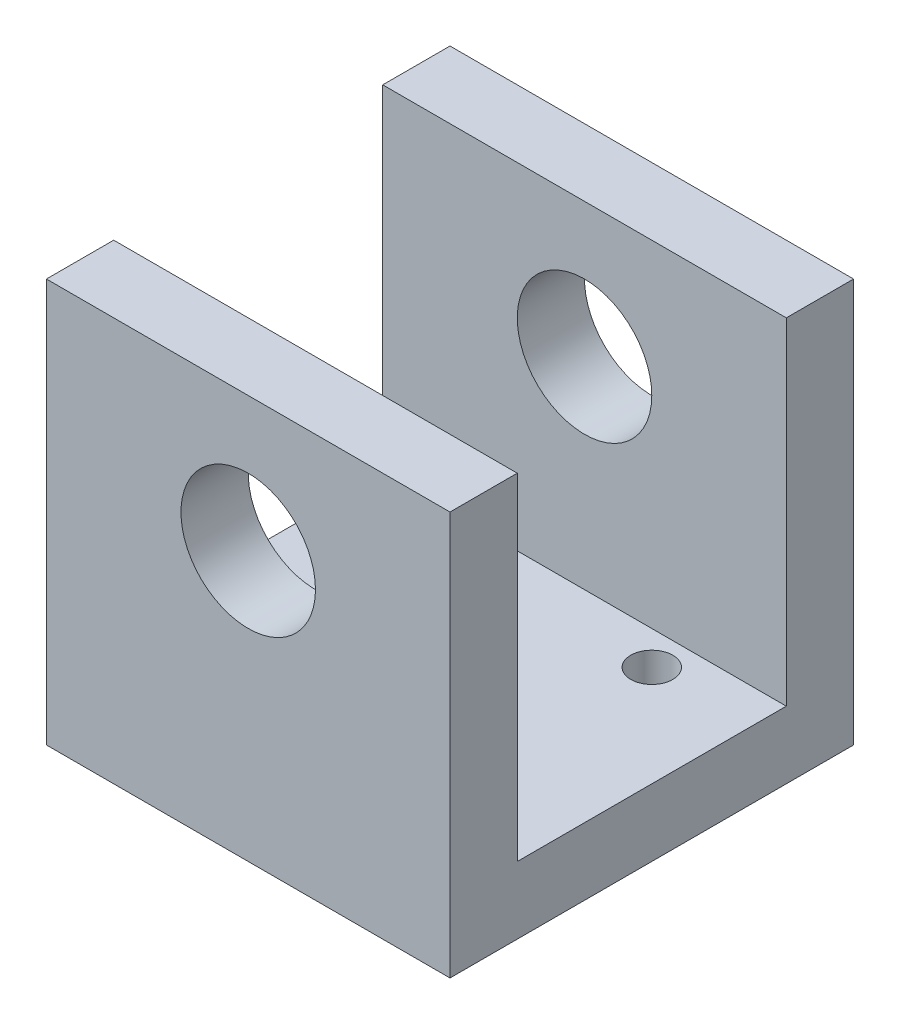
ISO-10303-21;
HEADER;
FILE_DESCRIPTION(('STEP AP214'),'2;1');
FILE_NAME('part.step','',(''),(''),'','','');
FILE_SCHEMA(('AUTOMOTIVE_DESIGN { 1 0 10303 214 1 1 1 1 }'));
ENDSEC;
DATA;
#1=APPLICATION_CONTEXT('core data for automotive mechanical design processes');
#2=APPLICATION_PROTOCOL_DEFINITION('international standard','automotive_design',2000,#1);
#3=PRODUCT_CONTEXT('',#1,'mechanical');
#4=PRODUCT('Part','Part','',(#3));
#5=PRODUCT_RELATED_PRODUCT_CATEGORY('part','',(#4));
#6=PRODUCT_DEFINITION_FORMATION('','',#4);
#7=PRODUCT_DEFINITION_CONTEXT('part definition',#1,'design');
#8=PRODUCT_DEFINITION('design','',#6,#7);
#9=PRODUCT_DEFINITION_SHAPE('','',#8);
#10=(LENGTH_UNIT() NAMED_UNIT(*) SI_UNIT(.MILLI.,.METRE.));
#11=(NAMED_UNIT(*) PLANE_ANGLE_UNIT() SI_UNIT($,.RADIAN.));
#12=(NAMED_UNIT(*) SI_UNIT($,.STERADIAN.) SOLID_ANGLE_UNIT());
#13=UNCERTAINTY_MEASURE_WITH_UNIT(LENGTH_MEASURE(1.E-05),#10,'distance_accuracy_value','');
#14=(GEOMETRIC_REPRESENTATION_CONTEXT(3) GLOBAL_UNCERTAINTY_ASSIGNED_CONTEXT((#13)) GLOBAL_UNIT_ASSIGNED_CONTEXT((#10,
#11,#12)) REPRESENTATION_CONTEXT('',''));
#15=CARTESIAN_POINT('',(0.,0.,0.));
#16=DIRECTION('',(0.,0.,1.));
#17=DIRECTION('',(1.,0.,0.));
#18=AXIS2_PLACEMENT_3D('',#15,#16,#17);
#19=CARTESIAN_POINT('',(57.15,12.7,-57.15));
#20=DIRECTION('',(0.,1.,0.));
#21=DIRECTION('',(0.,0.,1.));
#22=AXIS2_PLACEMENT_3D('',#19,#20,#21);
#23=CYLINDRICAL_SURFACE('',#22,3.96875);
#24=CARTESIAN_POINT('',(57.15,0.,-57.15));
#25=DIRECTION('',(0.,1.,0.));
#26=DIRECTION('',(0.,0.,1.));
#27=AXIS2_PLACEMENT_3D('',#24,#25,#26);
#28=CIRCLE('',#27,3.96875);
#29=CARTESIAN_POINT('',(57.15,0.,-53.18125));
#30=VERTEX_POINT('',#29);
#31=EDGE_CURVE('E47',#30,#30,#28,.T.);
#32=ORIENTED_EDGE('',*,*,#31,.F.);
#33=EDGE_LOOP('',(#32));
#34=FACE_BOUND('',#33,.T.);
#35=CARTESIAN_POINT('',(57.15,12.7,-57.15));
#36=DIRECTION('',(0.,1.,0.));
#37=DIRECTION('',(0.,0.,1.));
#38=AXIS2_PLACEMENT_3D('',#35,#36,#37);
#39=CIRCLE('',#38,3.96875);
#40=CARTESIAN_POINT('',(57.15,12.7,-53.18125));
#41=VERTEX_POINT('',#40);
#42=EDGE_CURVE('E11',#41,#41,#39,.T.);
#43=ORIENTED_EDGE('',*,*,#42,.T.);
#44=EDGE_LOOP('',(#43));
#45=FACE_BOUND('',#44,.T.);
#46=ADVANCED_FACE('F39',(#34,#45),#23,.F.);
#47=CARTESIAN_POINT('',(19.05,12.7,-57.15));
#48=DIRECTION('',(0.,1.,0.));
#49=DIRECTION('',(0.,0.,1.));
#50=AXIS2_PLACEMENT_3D('',#47,#48,#49);
#51=CYLINDRICAL_SURFACE('',#50,3.96875);
#52=CARTESIAN_POINT('',(19.05,0.,-57.15));
#53=DIRECTION('',(0.,1.,0.));
#54=DIRECTION('',(0.,0.,1.));
#55=AXIS2_PLACEMENT_3D('',#52,#53,#54);
#56=CIRCLE('',#55,3.96875);
#57=CARTESIAN_POINT('',(19.05,0.,-53.18125));
#58=VERTEX_POINT('',#57);
#59=EDGE_CURVE('E167',#58,#58,#56,.T.);
#60=ORIENTED_EDGE('',*,*,#59,.F.);
#61=EDGE_LOOP('',(#60));
#62=FACE_BOUND('',#61,.T.);
#63=CARTESIAN_POINT('',(19.05,12.7,-57.15));
#64=DIRECTION('',(0.,1.,0.));
#65=DIRECTION('',(0.,0.,1.));
#66=AXIS2_PLACEMENT_3D('',#63,#64,#65);
#67=CIRCLE('',#66,3.96875);
#68=CARTESIAN_POINT('',(19.05,12.7,-53.18125));
#69=VERTEX_POINT('',#68);
#70=EDGE_CURVE('E174',#69,#69,#67,.T.);
#71=ORIENTED_EDGE('',*,*,#70,.T.);
#72=EDGE_LOOP('',(#71));
#73=FACE_BOUND('',#72,.T.);
#74=ADVANCED_FACE('F183',(#62,#73),#51,.F.);
#75=CARTESIAN_POINT('',(76.2,76.2,0.));
#76=DIRECTION('',(0.,0.,-1.));
#77=DIRECTION('',(0.,1.,0.));
#78=AXIS2_PLACEMENT_3D('',#75,#76,#77);
#79=PLANE('',#78);
#80=CARTESIAN_POINT('',(38.1,50.8,0.));
#81=DIRECTION('',(0.,0.,1.));
#82=DIRECTION('',(1.,0.,0.));
#83=AXIS2_PLACEMENT_3D('',#80,#81,#82);
#84=CIRCLE('',#83,12.7);
#85=CARTESIAN_POINT('',(50.8,50.8,0.));
#86=VERTEX_POINT('',#85);
#87=EDGE_CURVE('E312',#86,#86,#84,.T.);
#88=ORIENTED_EDGE('',*,*,#87,.F.);
#89=EDGE_LOOP('',(#88));
#90=FACE_BOUND('',#89,.T.);
#91=DIRECTION('',(0.,-1.,0.));
#92=VECTOR('',#91,1.);
#93=CARTESIAN_POINT('',(0.,76.2,0.));
#94=LINE('',#93,#92);
#95=CARTESIAN_POINT('',(0.,76.2,0.));
#96=VERTEX_POINT('',#95);
#97=CARTESIAN_POINT('',(0.,0.,0.));
#98=VERTEX_POINT('',#97);
#99=EDGE_CURVE('E137',#96,#98,#94,.T.);
#100=ORIENTED_EDGE('',*,*,#99,.T.);
#101=DIRECTION('',(-1.,0.,0.));
#102=VECTOR('',#101,1.);
#103=CARTESIAN_POINT('',(76.2,0.,0.));
#104=LINE('',#103,#102);
#105=CARTESIAN_POINT('',(76.2,0.,0.));
#106=VERTEX_POINT('',#105);
#107=EDGE_CURVE('E165',#106,#98,#104,.T.);
#108=ORIENTED_EDGE('',*,*,#107,.F.);
#109=DIRECTION('',(0.,-1.,0.));
#110=VECTOR('',#109,1.);
#111=CARTESIAN_POINT('',(76.2,76.2,0.));
#112=LINE('',#111,#110);
#113=CARTESIAN_POINT('',(76.2,76.2,0.));
#114=VERTEX_POINT('',#113);
#115=EDGE_CURVE('E152',#114,#106,#112,.T.);
#116=ORIENTED_EDGE('',*,*,#115,.F.);
#117=DIRECTION('',(-1.,0.,0.));
#118=VECTOR('',#117,1.);
#119=CARTESIAN_POINT('',(76.2,76.2,0.));
#120=LINE('',#119,#118);
#121=EDGE_CURVE('E133',#114,#96,#120,.T.);
#122=ORIENTED_EDGE('',*,*,#121,.T.);
#123=EDGE_LOOP('',(#100,#108,#116,#122));
#124=FACE_BOUND('',#123,.T.);
#125=ADVANCED_FACE('F214',(#90,#124),#79,.F.);
#126=CARTESIAN_POINT('',(76.2,0.,0.));
#127=DIRECTION('',(0.,1.,0.));
#128=DIRECTION('',(0.,0.,1.));
#129=AXIS2_PLACEMENT_3D('',#126,#127,#128);
#130=PLANE('',#129);
#131=CARTESIAN_POINT('',(57.15,0.,-19.05));
#132=DIRECTION('',(0.,1.,0.));
#133=DIRECTION('',(0.,0.,1.));
#134=AXIS2_PLACEMENT_3D('',#131,#132,#133);
#135=CIRCLE('',#134,3.96875);
#136=CARTESIAN_POINT('',(57.15,0.,-15.08125));
#137=VERTEX_POINT('',#136);
#138=EDGE_CURVE('E315',#137,#137,#135,.T.);
#139=ORIENTED_EDGE('',*,*,#138,.T.);
#140=EDGE_LOOP('',(#139));
#141=FACE_BOUND('',#140,.T.);
#142=CARTESIAN_POINT('',(19.05,0.,-19.05));
#143=DIRECTION('',(0.,1.,0.));
#144=DIRECTION('',(0.,0.,1.));
#145=AXIS2_PLACEMENT_3D('',#142,#143,#144);
#146=CIRCLE('',#145,3.96875);
#147=CARTESIAN_POINT('',(19.05,0.,-15.08125));
#148=VERTEX_POINT('',#147);
#149=EDGE_CURVE('E306',#148,#148,#146,.T.);
#150=ORIENTED_EDGE('',*,*,#149,.T.);
#151=EDGE_LOOP('',(#150));
#152=FACE_BOUND('',#151,.T.);
#153=DIRECTION('',(0.,0.,-1.));
#154=VECTOR('',#153,1.);
#155=CARTESIAN_POINT('',(0.,0.,0.));
#156=LINE('',#155,#154);
#157=CARTESIAN_POINT('',(0.,0.,-76.2));
#158=VERTEX_POINT('',#157);
#159=EDGE_CURVE('E140',#98,#158,#156,.T.);
#160=ORIENTED_EDGE('',*,*,#159,.T.);
#161=DIRECTION('',(-1.,0.,0.));
#162=VECTOR('',#161,1.);
#163=CARTESIAN_POINT('',(76.2,0.,-76.2));
#164=LINE('',#163,#162);
#165=CARTESIAN_POINT('',(76.2,0.,-76.2));
#166=VERTEX_POINT('',#165);
#167=EDGE_CURVE('E162',#166,#158,#164,.T.);
#168=ORIENTED_EDGE('',*,*,#167,.F.);
#169=DIRECTION('',(0.,0.,-1.));
#170=VECTOR('',#169,1.);
#171=CARTESIAN_POINT('',(76.2,0.,0.));
#172=LINE('',#171,#170);
#173=EDGE_CURVE('E99',#106,#166,#172,.T.);
#174=ORIENTED_EDGE('',*,*,#173,.F.);
#175=ORIENTED_EDGE('',*,*,#107,.T.);
#176=EDGE_LOOP('',(#160,#168,#174,#175));
#177=FACE_BOUND('',#176,.T.);
#178=ORIENTED_EDGE('',*,*,#59,.T.);
#179=EDGE_LOOP('',(#178));
#180=FACE_BOUND('',#179,.T.);
#181=ORIENTED_EDGE('',*,*,#31,.T.);
#182=EDGE_LOOP('',(#181));
#183=FACE_BOUND('',#182,.T.);
#184=ADVANCED_FACE('F179',(#141,#152,#177,#180,#183),#130,.F.);
#185=CARTESIAN_POINT('',(76.2,0.,-76.2));
#186=DIRECTION('',(0.,0.,1.));
#187=DIRECTION('',(0.,-1.,0.));
#188=AXIS2_PLACEMENT_3D('',#185,#186,#187);
#189=PLANE('',#188);
#190=CARTESIAN_POINT('',(38.1,50.8,-76.2));
#191=DIRECTION('',(0.,0.,1.));
#192=DIRECTION('',(1.,0.,0.));
#193=AXIS2_PLACEMENT_3D('',#190,#191,#192);
#194=CIRCLE('',#193,12.7);
#195=CARTESIAN_POINT('',(50.8,50.8,-76.2));
#196=VERTEX_POINT('',#195);
#197=EDGE_CURVE('E171',#196,#196,#194,.T.);
#198=ORIENTED_EDGE('',*,*,#197,.T.);
#199=EDGE_LOOP('',(#198));
#200=FACE_BOUND('',#199,.T.);
#201=DIRECTION('',(0.,1.,0.));
#202=VECTOR('',#201,1.);
#203=CARTESIAN_POINT('',(0.,0.,-76.2));
#204=LINE('',#203,#202);
#205=CARTESIAN_POINT('',(0.,76.2,-76.2));
#206=VERTEX_POINT('',#205);
#207=EDGE_CURVE('E143',#158,#206,#204,.T.);
#208=ORIENTED_EDGE('',*,*,#207,.T.);
#209=DIRECTION('',(-1.,0.,0.));
#210=VECTOR('',#209,1.);
#211=CARTESIAN_POINT('',(76.2,76.2,-76.2));
#212=LINE('',#211,#210);
#213=CARTESIAN_POINT('',(76.2,76.2,-76.2));
#214=VERTEX_POINT('',#213);
#215=EDGE_CURVE('E159',#214,#206,#212,.T.);
#216=ORIENTED_EDGE('',*,*,#215,.F.);
#217=DIRECTION('',(0.,1.,0.));
#218=VECTOR('',#217,1.);
#219=CARTESIAN_POINT('',(76.2,0.,-76.2));
#220=LINE('',#219,#218);
#221=EDGE_CURVE('E327',#166,#214,#220,.T.);
#222=ORIENTED_EDGE('',*,*,#221,.F.);
#223=ORIENTED_EDGE('',*,*,#167,.T.);
#224=EDGE_LOOP('',(#208,#216,#222,#223));
#225=FACE_BOUND('',#224,.T.);
#226=ADVANCED_FACE('F208',(#200,#225),#189,.F.);
#227=CARTESIAN_POINT('',(76.2,76.2,-76.2));
#228=DIRECTION('',(0.,-1.,0.));
#229=DIRECTION('',(0.,0.,-1.));
#230=AXIS2_PLACEMENT_3D('',#227,#228,#229);
#231=PLANE('',#230);
#232=DIRECTION('',(0.,0.,1.));
#233=VECTOR('',#232,1.);
#234=CARTESIAN_POINT('',(0.,76.2,-76.2));
#235=LINE('',#234,#233);
#236=CARTESIAN_POINT('',(0.,76.2,-63.5));
#237=VERTEX_POINT('',#236);
#238=EDGE_CURVE('E145',#206,#237,#235,.T.);
#239=ORIENTED_EDGE('',*,*,#238,.T.);
#240=DIRECTION('',(-1.,0.,0.));
#241=VECTOR('',#240,1.);
#242=CARTESIAN_POINT('',(76.2,76.2,-63.5));
#243=LINE('',#242,#241);
#244=CARTESIAN_POINT('',(76.2,76.2,-63.5));
#245=VERTEX_POINT('',#244);
#246=EDGE_CURVE('E156',#245,#237,#243,.T.);
#247=ORIENTED_EDGE('',*,*,#246,.F.);
#248=DIRECTION('',(0.,0.,1.));
#249=VECTOR('',#248,1.);
#250=CARTESIAN_POINT('',(76.2,76.2,-76.2));
#251=LINE('',#250,#249);
#252=EDGE_CURVE('E329',#214,#245,#251,.T.);
#253=ORIENTED_EDGE('',*,*,#252,.F.);
#254=ORIENTED_EDGE('',*,*,#215,.T.);
#255=EDGE_LOOP('',(#239,#247,#253,#254));
#256=FACE_BOUND('',#255,.T.);
#257=ADVANCED_FACE('F199',(#256),#231,.F.);
#258=CARTESIAN_POINT('',(76.2,76.2,-63.5));
#259=DIRECTION('',(0.,0.,-1.));
#260=DIRECTION('',(-1.,0.,0.));
#261=AXIS2_PLACEMENT_3D('',#258,#259,#260);
#262=PLANE('',#261);
#263=CARTESIAN_POINT('',(38.1,50.8,-63.5));
#264=DIRECTION('',(0.,0.,-1.));
#265=DIRECTION('',(-1.,0.,0.));
#266=AXIS2_PLACEMENT_3D('',#263,#264,#265);
#267=CIRCLE('',#266,12.7);
#268=CARTESIAN_POINT('',(50.8,50.8,-63.5));
#269=VERTEX_POINT('',#268);
#270=EDGE_CURVE('E141',#269,#269,#267,.T.);
#271=ORIENTED_EDGE('',*,*,#270,.T.);
#272=EDGE_LOOP('',(#271));
#273=FACE_BOUND('',#272,.T.);
#274=DIRECTION('',(0.,-1.,0.));
#275=VECTOR('',#274,1.);
#276=CARTESIAN_POINT('',(0.,76.2,-63.5));
#277=LINE('',#276,#275);
#278=CARTESIAN_POINT('',(0.,12.7,-63.5));
#279=VERTEX_POINT('',#278);
#280=EDGE_CURVE('E147',#237,#279,#277,.T.);
#281=ORIENTED_EDGE('',*,*,#280,.T.);
#282=DIRECTION('',(-1.,0.,0.));
#283=VECTOR('',#282,1.);
#284=CARTESIAN_POINT('',(76.2,12.7,-63.5));
#285=LINE('',#284,#283);
#286=CARTESIAN_POINT('',(76.2,12.7,-63.5));
#287=VERTEX_POINT('',#286);
#288=EDGE_CURVE('E128',#287,#279,#285,.T.);
#289=ORIENTED_EDGE('',*,*,#288,.F.);
#290=DIRECTION('',(0.,-1.,0.));
#291=VECTOR('',#290,1.);
#292=CARTESIAN_POINT('',(76.2,76.2,-63.5));
#293=LINE('',#292,#291);
#294=EDGE_CURVE('E118',#245,#287,#293,.T.);
#295=ORIENTED_EDGE('',*,*,#294,.F.);
#296=ORIENTED_EDGE('',*,*,#246,.T.);
#297=EDGE_LOOP('',(#281,#289,#295,#296));
#298=FACE_BOUND('',#297,.T.);
#299=ADVANCED_FACE('F187',(#273,#298),#262,.F.);
#300=CARTESIAN_POINT('',(76.2,12.7,-63.5));
#301=DIRECTION('',(0.,-1.,0.));
#302=DIRECTION('',(0.,0.,-1.));
#303=AXIS2_PLACEMENT_3D('',#300,#301,#302);
#304=PLANE('',#303);
#305=CARTESIAN_POINT('',(57.15,12.7,-19.05));
#306=DIRECTION('',(0.,1.,0.));
#307=DIRECTION('',(0.,0.,1.));
#308=AXIS2_PLACEMENT_3D('',#305,#306,#307);
#309=CIRCLE('',#308,3.96875);
#310=CARTESIAN_POINT('',(57.15,12.7,-15.08125));
#311=VERTEX_POINT('',#310);
#312=EDGE_CURVE('E310',#311,#311,#309,.T.);
#313=ORIENTED_EDGE('',*,*,#312,.F.);
#314=EDGE_LOOP('',(#313));
#315=FACE_BOUND('',#314,.T.);
#316=CARTESIAN_POINT('',(19.05,12.7,-19.05));
#317=DIRECTION('',(0.,1.,0.));
#318=DIRECTION('',(0.,0.,1.));
#319=AXIS2_PLACEMENT_3D('',#316,#317,#318);
#320=CIRCLE('',#319,3.96875);
#321=CARTESIAN_POINT('',(19.05,12.7,-15.08125));
#322=VERTEX_POINT('',#321);
#323=EDGE_CURVE('E309',#322,#322,#320,.T.);
#324=ORIENTED_EDGE('',*,*,#323,.F.);
#325=EDGE_LOOP('',(#324));
#326=FACE_BOUND('',#325,.T.);
#327=DIRECTION('',(0.,0.,1.));
#328=VECTOR('',#327,1.);
#329=CARTESIAN_POINT('',(0.,12.7,-63.5));
#330=LINE('',#329,#328);
#331=CARTESIAN_POINT('',(0.,12.7,-12.7));
#332=VERTEX_POINT('',#331);
#333=EDGE_CURVE('E127',#279,#332,#330,.T.);
#334=ORIENTED_EDGE('',*,*,#333,.T.);
#335=DIRECTION('',(-1.,0.,0.));
#336=VECTOR('',#335,1.);
#337=CARTESIAN_POINT('',(76.2,12.7,-12.7));
#338=LINE('',#337,#336);
#339=CARTESIAN_POINT('',(76.2,12.7,-12.7));
#340=VERTEX_POINT('',#339);
#341=EDGE_CURVE('E123',#340,#332,#338,.T.);
#342=ORIENTED_EDGE('',*,*,#341,.F.);
#343=DIRECTION('',(0.,0.,1.));
#344=VECTOR('',#343,1.);
#345=CARTESIAN_POINT('',(76.2,12.7,-63.5));
#346=LINE('',#345,#344);
#347=EDGE_CURVE('E112',#287,#340,#346,.T.);
#348=ORIENTED_EDGE('',*,*,#347,.F.);
#349=ORIENTED_EDGE('',*,*,#288,.T.);
#350=EDGE_LOOP('',(#334,#342,#348,#349));
#351=FACE_BOUND('',#350,.T.);
#352=ORIENTED_EDGE('',*,*,#70,.F.);
#353=EDGE_LOOP('',(#352));
#354=FACE_BOUND('',#353,.T.);
#355=ORIENTED_EDGE('',*,*,#42,.F.);
#356=EDGE_LOOP('',(#355));
#357=FACE_BOUND('',#356,.T.);
#358=ADVANCED_FACE('F124',(#315,#326,#351,#354,#357),#304,.F.);
#359=CARTESIAN_POINT('',(76.2,12.7,-12.7));
#360=DIRECTION('',(0.,0.,1.));
#361=DIRECTION('',(1.,0.,0.));
#362=AXIS2_PLACEMENT_3D('',#359,#360,#361);
#363=PLANE('',#362);
#364=CARTESIAN_POINT('',(38.1,50.8,-12.7));
#365=DIRECTION('',(0.,0.,1.));
#366=DIRECTION('',(1.,0.,0.));
#367=AXIS2_PLACEMENT_3D('',#364,#365,#366);
#368=CIRCLE('',#367,12.7);
#369=CARTESIAN_POINT('',(50.8,50.8,-12.7));
#370=VERTEX_POINT('',#369);
#371=EDGE_CURVE('E168',#370,#370,#368,.T.);
#372=ORIENTED_EDGE('',*,*,#371,.T.);
#373=EDGE_LOOP('',(#372));
#374=FACE_BOUND('',#373,.T.);
#375=DIRECTION('',(0.,1.,0.));
#376=VECTOR('',#375,1.);
#377=CARTESIAN_POINT('',(0.,12.7,-12.7));
#378=LINE('',#377,#376);
#379=CARTESIAN_POINT('',(0.,76.2,-12.7));
#380=VERTEX_POINT('',#379);
#381=EDGE_CURVE('E84',#332,#380,#378,.T.);
#382=ORIENTED_EDGE('',*,*,#381,.T.);
#383=DIRECTION('',(-1.,0.,0.));
#384=VECTOR('',#383,1.);
#385=CARTESIAN_POINT('',(76.2,76.2,-12.7));
#386=LINE('',#385,#384);
#387=CARTESIAN_POINT('',(76.2,76.2,-12.7));
#388=VERTEX_POINT('',#387);
#389=EDGE_CURVE('E129',#388,#380,#386,.T.);
#390=ORIENTED_EDGE('',*,*,#389,.F.);
#391=DIRECTION('',(0.,1.,0.));
#392=VECTOR('',#391,1.);
#393=CARTESIAN_POINT('',(76.2,12.7,-12.7));
#394=LINE('',#393,#392);
#395=EDGE_CURVE('E116',#340,#388,#394,.T.);
#396=ORIENTED_EDGE('',*,*,#395,.F.);
#397=ORIENTED_EDGE('',*,*,#341,.T.);
#398=EDGE_LOOP('',(#382,#390,#396,#397));
#399=FACE_BOUND('',#398,.T.);
#400=ADVANCED_FACE('F131',(#374,#399),#363,.F.);
#401=CARTESIAN_POINT('',(76.2,76.2,-12.7));
#402=DIRECTION('',(0.,-1.,0.));
#403=DIRECTION('',(0.,0.,-1.));
#404=AXIS2_PLACEMENT_3D('',#401,#402,#403);
#405=PLANE('',#404);
#406=DIRECTION('',(0.,0.,1.));
#407=VECTOR('',#406,1.);
#408=CARTESIAN_POINT('',(0.,76.2,-12.7));
#409=LINE('',#408,#407);
#410=EDGE_CURVE('E90',#380,#96,#409,.T.);
#411=ORIENTED_EDGE('',*,*,#410,.T.);
#412=ORIENTED_EDGE('',*,*,#121,.F.);
#413=DIRECTION('',(0.,0.,1.));
#414=VECTOR('',#413,1.);
#415=CARTESIAN_POINT('',(76.2,76.2,-12.7));
#416=LINE('',#415,#414);
#417=EDGE_CURVE('E55',#388,#114,#416,.T.);
#418=ORIENTED_EDGE('',*,*,#417,.F.);
#419=ORIENTED_EDGE('',*,*,#389,.T.);
#420=EDGE_LOOP('',(#411,#412,#418,#419));
#421=FACE_BOUND('',#420,.T.);
#422=ADVANCED_FACE('F195',(#421),#405,.F.);
#423=CARTESIAN_POINT('',(76.2,0.,0.));
#424=DIRECTION('',(1.,0.,0.));
#425=DIRECTION('',(0.,0.,-1.));
#426=AXIS2_PLACEMENT_3D('',#423,#424,#425);
#427=PLANE('',#426);
#428=ORIENTED_EDGE('',*,*,#115,.T.);
#429=ORIENTED_EDGE('',*,*,#173,.T.);
#430=ORIENTED_EDGE('',*,*,#221,.T.);
#431=ORIENTED_EDGE('',*,*,#252,.T.);
#432=ORIENTED_EDGE('',*,*,#294,.T.);
#433=ORIENTED_EDGE('',*,*,#347,.T.);
#434=ORIENTED_EDGE('',*,*,#395,.T.);
#435=ORIENTED_EDGE('',*,*,#417,.T.);
#436=EDGE_LOOP('',(#428,#429,#430,#431,#432,#433,#434,#435));
#437=FACE_BOUND('',#436,.T.);
#438=ADVANCED_FACE('F114',(#437),#427,.T.);
#439=CARTESIAN_POINT('',(0.,0.,0.));
#440=DIRECTION('',(1.,0.,0.));
#441=DIRECTION('',(0.,0.,-1.));
#442=AXIS2_PLACEMENT_3D('',#439,#440,#441);
#443=PLANE('',#442);
#444=ORIENTED_EDGE('',*,*,#99,.F.);
#445=ORIENTED_EDGE('',*,*,#410,.F.);
#446=ORIENTED_EDGE('',*,*,#381,.F.);
#447=ORIENTED_EDGE('',*,*,#333,.F.);
#448=ORIENTED_EDGE('',*,*,#280,.F.);
#449=ORIENTED_EDGE('',*,*,#238,.F.);
#450=ORIENTED_EDGE('',*,*,#207,.F.);
#451=ORIENTED_EDGE('',*,*,#159,.F.);
#452=EDGE_LOOP('',(#444,#445,#446,#447,#448,#449,#450,#451));
#453=FACE_BOUND('',#452,.T.);
#454=ADVANCED_FACE('F268',(#453),#443,.F.);
#455=CARTESIAN_POINT('',(38.1,50.8,-76.2));
#456=DIRECTION('',(0.,0.,1.));
#457=DIRECTION('',(1.,0.,0.));
#458=AXIS2_PLACEMENT_3D('',#455,#456,#457);
#459=CYLINDRICAL_SURFACE('',#458,12.7);
#460=CARTESIAN_POINT('',(50.8,50.8,0.));
#461=CARTESIAN_POINT('',(50.8,50.8,-0.132291666666668));
#462=CARTESIAN_POINT('',(50.8,50.8,-0.264583333333337));
#463=CARTESIAN_POINT('',(50.8,50.8,-0.529166666666669));
#464=CARTESIAN_POINT('',(50.8,50.8,-0.661458333333332));
#465=CARTESIAN_POINT('',(50.8,50.8,-0.926041666666664));
#466=CARTESIAN_POINT('',(50.8,50.8,-1.05833333333333));
#467=CARTESIAN_POINT('',(50.8,50.8,-1.32291666666667));
#468=CARTESIAN_POINT('',(50.8,50.8,-1.45520833333334));
#469=CARTESIAN_POINT('',(50.8,50.8,-1.71979166666667));
#470=CARTESIAN_POINT('',(50.8,50.8,-1.85208333333333));
#471=CARTESIAN_POINT('',(50.8,50.8,-2.11666666666666));
#472=CARTESIAN_POINT('',(50.8,50.8,-2.24895833333333));
#473=CARTESIAN_POINT('',(50.8,50.8,-2.51354166666667));
#474=CARTESIAN_POINT('',(50.8,50.8,-2.64583333333334));
#475=CARTESIAN_POINT('',(50.8,50.8,-2.91041666666667));
#476=CARTESIAN_POINT('',(50.8,50.8,-3.04270833333334));
#477=CARTESIAN_POINT('',(50.8,50.8,-3.30729166666667));
#478=CARTESIAN_POINT('',(50.8,50.8,-3.43958333333334));
#479=CARTESIAN_POINT('',(50.8,50.8,-3.70416666666667));
#480=CARTESIAN_POINT('',(50.8,50.8,-3.83645833333334));
#481=CARTESIAN_POINT('',(50.8,50.8,-4.10104166666668));
#482=CARTESIAN_POINT('',(50.8,50.8,-4.23333333333334));
#483=CARTESIAN_POINT('',(50.8,50.8,-4.49791666666668));
#484=CARTESIAN_POINT('',(50.8,50.8,-4.63020833333334));
#485=CARTESIAN_POINT('',(50.8,50.8,-4.89479166666667));
#486=CARTESIAN_POINT('',(50.8,50.8,-5.02708333333334));
#487=CARTESIAN_POINT('',(50.8,50.8,-5.29166666666668));
#488=CARTESIAN_POINT('',(50.8,50.8,-5.42395833333334));
#489=CARTESIAN_POINT('',(50.8,50.8,-5.68854166666668));
#490=CARTESIAN_POINT('',(50.8,50.8,-5.82083333333334));
#491=CARTESIAN_POINT('',(50.8,50.8,-6.08541666666667));
#492=CARTESIAN_POINT('',(50.8,50.8,-6.21770833333334));
#493=CARTESIAN_POINT('',(50.8,50.8,-6.48229166666668));
#494=CARTESIAN_POINT('',(50.8,50.8,-6.61458333333334));
#495=CARTESIAN_POINT('',(50.8,50.8,-6.87916666666668));
#496=CARTESIAN_POINT('',(50.8,50.8,-7.01145833333334));
#497=CARTESIAN_POINT('',(50.8,50.8,-7.27604166666667));
#498=CARTESIAN_POINT('',(50.8,50.8,-7.40833333333334));
#499=CARTESIAN_POINT('',(50.8,50.8,-7.67291666666668));
#500=CARTESIAN_POINT('',(50.8,50.8,-7.80520833333335));
#501=CARTESIAN_POINT('',(50.8,50.8,-8.06979166666668));
#502=CARTESIAN_POINT('',(50.8,50.8,-8.20208333333334));
#503=CARTESIAN_POINT('',(50.8,50.8,-8.46666666666667));
#504=CARTESIAN_POINT('',(50.8,50.8,-8.59895833333334));
#505=CARTESIAN_POINT('',(50.8,50.8,-8.86354166666668));
#506=CARTESIAN_POINT('',(50.8,50.8,-8.99583333333335));
#507=CARTESIAN_POINT('',(50.8,50.8,-9.26041666666668));
#508=CARTESIAN_POINT('',(50.8,50.8,-9.39270833333334));
#509=CARTESIAN_POINT('',(50.8,50.8,-9.65729166666667));
#510=CARTESIAN_POINT('',(50.8,50.8,-9.78958333333334));
#511=CARTESIAN_POINT('',(50.8,50.8,-10.0541666666667));
#512=CARTESIAN_POINT('',(50.8,50.8,-10.1864583333333));
#513=CARTESIAN_POINT('',(50.8,50.8,-10.4510416666667));
#514=CARTESIAN_POINT('',(50.8,50.8,-10.5833333333333));
#515=CARTESIAN_POINT('',(50.8,50.8,-10.8479166666667));
#516=CARTESIAN_POINT('',(50.8,50.8,-10.9802083333333));
#517=CARTESIAN_POINT('',(50.8,50.8,-11.2447916666667));
#518=CARTESIAN_POINT('',(50.8,50.8,-11.3770833333333));
#519=CARTESIAN_POINT('',(50.8,50.8,-11.6416666666667));
#520=CARTESIAN_POINT('',(50.8,50.8,-11.7739583333334));
#521=CARTESIAN_POINT('',(50.8,50.8,-12.0385416666667));
#522=CARTESIAN_POINT('',(50.8,50.8,-12.1708333333333));
#523=CARTESIAN_POINT('',(50.8,50.8,-12.4354166666667));
#524=CARTESIAN_POINT('',(50.8,50.8,-12.5677083333333));
#525=CARTESIAN_POINT('',(50.8,50.8,-12.7));
#526=B_SPLINE_CURVE_WITH_KNOTS('',3,(#460,#461,#462,#463,#464,#465,#466,#467,#468,#469,#470,
#471,#472,#473,#474,#475,#476,#477,#478,#479,#480,#481,#482,#483,#484,#485,#486,#487,#488,#489,
#490,#491,#492,#493,#494,#495,#496,#497,#498,#499,#500,#501,#502,#503,#504,#505,#506,#507,#508,
#509,#510,#511,#512,#513,#514,#515,#516,#517,#518,#519,#520,#521,#522,#523,#524,#525),
.UNSPECIFIED.,.F.,.F.,(4,2,2,2,2,2,2,2,2,2,2,2,2,2,2,2,2,2,2,2,2,2,2,2,2,2,2,2,2,2,2,2,4),(0.,
0.396875000000005,0.793749999999996,1.190625,1.58750000000001,1.984375,2.38125,2.77812500000001,
3.17500000000001,3.571875,3.96875000000001,4.36562500000001,4.7625,5.15937500000001,
5.55625000000001,5.953125,6.35000000000001,6.74687500000001,7.14375,7.54062500000001,
7.93750000000001,8.334375,8.73125000000001,9.12812500000001,9.52500000000001,9.92187500000001,
10.31875,10.715625,11.1125,11.509375,11.90625,12.303125,12.7),.UNSPECIFIED.);
#527=EDGE_CURVE('BSEAM275',#86,#370,#526,.T.);
#528=ORIENTED_EDGE('',*,*,#87,.T.);
#529=ORIENTED_EDGE('',*,*,#371,.F.);
#530=ORIENTED_EDGE('',*,*,#527,.T.);
#531=ORIENTED_EDGE('',*,*,#527,.F.);
#532=EDGE_LOOP('',(#528,#530,#529,#531));
#533=FACE_BOUND('',#532,.T.);
#534=ADVANCED_FACE('F275',(#533),#459,.F.);
#535=CARTESIAN_POINT('',(50.8,50.8,-76.2));
#536=CARTESIAN_POINT('',(50.8,50.8,-76.0677083333333));
#537=CARTESIAN_POINT('',(50.8,50.8,-75.9354166666667));
#538=CARTESIAN_POINT('',(50.8,50.8,-75.6708333333333));
#539=CARTESIAN_POINT('',(50.8,50.8,-75.5385416666667));
#540=CARTESIAN_POINT('',(50.8,50.8,-75.2739583333333));
#541=CARTESIAN_POINT('',(50.8,50.8,-75.1416666666667));
#542=CARTESIAN_POINT('',(50.8,50.8,-74.8770833333333));
#543=CARTESIAN_POINT('',(50.8,50.8,-74.7447916666667));
#544=CARTESIAN_POINT('',(50.8,50.8,-74.4802083333333));
#545=CARTESIAN_POINT('',(50.8,50.8,-74.3479166666667));
#546=CARTESIAN_POINT('',(50.8,50.8,-74.0833333333333));
#547=CARTESIAN_POINT('',(50.8,50.8,-73.9510416666667));
#548=CARTESIAN_POINT('',(50.8,50.8,-73.6864583333333));
#549=CARTESIAN_POINT('',(50.8,50.8,-73.5541666666667));
#550=CARTESIAN_POINT('',(50.8,50.8,-73.2895833333333));
#551=CARTESIAN_POINT('',(50.8,50.8,-73.1572916666667));
#552=CARTESIAN_POINT('',(50.8,50.8,-72.8927083333333));
#553=CARTESIAN_POINT('',(50.8,50.8,-72.7604166666667));
#554=CARTESIAN_POINT('',(50.8,50.8,-72.4958333333333));
#555=CARTESIAN_POINT('',(50.8,50.8,-72.3635416666667));
#556=CARTESIAN_POINT('',(50.8,50.8,-72.0989583333333));
#557=CARTESIAN_POINT('',(50.8,50.8,-71.9666666666667));
#558=CARTESIAN_POINT('',(50.8,50.8,-71.7020833333333));
#559=CARTESIAN_POINT('',(50.8,50.8,-71.5697916666667));
#560=CARTESIAN_POINT('',(50.8,50.8,-71.3052083333333));
#561=CARTESIAN_POINT('',(50.8,50.8,-71.1729166666667));
#562=CARTESIAN_POINT('',(50.8,50.8,-70.9083333333333));
#563=CARTESIAN_POINT('',(50.8,50.8,-70.7760416666667));
#564=CARTESIAN_POINT('',(50.8,50.8,-70.5114583333333));
#565=CARTESIAN_POINT('',(50.8,50.8,-70.3791666666667));
#566=CARTESIAN_POINT('',(50.8,50.8,-70.1145833333333));
#567=CARTESIAN_POINT('',(50.8,50.8,-69.9822916666667));
#568=CARTESIAN_POINT('',(50.8,50.8,-69.7177083333333));
#569=CARTESIAN_POINT('',(50.8,50.8,-69.5854166666667));
#570=CARTESIAN_POINT('',(50.8,50.8,-69.3208333333333));
#571=CARTESIAN_POINT('',(50.8,50.8,-69.1885416666667));
#572=CARTESIAN_POINT('',(50.8,50.8,-68.9239583333333));
#573=CARTESIAN_POINT('',(50.8,50.8,-68.7916666666667));
#574=CARTESIAN_POINT('',(50.8,50.8,-68.5270833333333));
#575=CARTESIAN_POINT('',(50.8,50.8,-68.3947916666667));
#576=CARTESIAN_POINT('',(50.8,50.8,-68.1302083333333));
#577=CARTESIAN_POINT('',(50.8,50.8,-67.9979166666667));
#578=CARTESIAN_POINT('',(50.8,50.8,-67.7333333333333));
#579=CARTESIAN_POINT('',(50.8,50.8,-67.6010416666667));
#580=CARTESIAN_POINT('',(50.8,50.8,-67.3364583333333));
#581=CARTESIAN_POINT('',(50.8,50.8,-67.2041666666667));
#582=CARTESIAN_POINT('',(50.8,50.8,-66.9395833333333));
#583=CARTESIAN_POINT('',(50.8,50.8,-66.8072916666667));
#584=CARTESIAN_POINT('',(50.8,50.8,-66.5427083333333));
#585=CARTESIAN_POINT('',(50.8,50.8,-66.4104166666667));
#586=CARTESIAN_POINT('',(50.8,50.8,-66.1458333333333));
#587=CARTESIAN_POINT('',(50.8,50.8,-66.0135416666667));
#588=CARTESIAN_POINT('',(50.8,50.8,-65.7489583333333));
#589=CARTESIAN_POINT('',(50.8,50.8,-65.6166666666667));
#590=CARTESIAN_POINT('',(50.8,50.8,-65.3520833333333));
#591=CARTESIAN_POINT('',(50.8,50.8,-65.2197916666667));
#592=CARTESIAN_POINT('',(50.8,50.8,-64.9552083333333));
#593=CARTESIAN_POINT('',(50.8,50.8,-64.8229166666667));
#594=CARTESIAN_POINT('',(50.8,50.8,-64.5583333333333));
#595=CARTESIAN_POINT('',(50.8,50.8,-64.4260416666667));
#596=CARTESIAN_POINT('',(50.8,50.8,-64.1614583333333));
#597=CARTESIAN_POINT('',(50.8,50.8,-64.0291666666667));
#598=CARTESIAN_POINT('',(50.8,50.8,-63.7645833333333));
#599=CARTESIAN_POINT('',(50.8,50.8,-63.6322916666667));
#600=CARTESIAN_POINT('',(50.8,50.8,-63.5));
#601=B_SPLINE_CURVE_WITH_KNOTS('',3,(#535,#536,#537,#538,#539,#540,#541,#542,#543,#544,#545,
#546,#547,#548,#549,#550,#551,#552,#553,#554,#555,#556,#557,#558,#559,#560,#561,#562,#563,#564,
#565,#566,#567,#568,#569,#570,#571,#572,#573,#574,#575,#576,#577,#578,#579,#580,#581,#582,#583,
#584,#585,#586,#587,#588,#589,#590,#591,#592,#593,#594,#595,#596,#597,#598,#599,#600),
.UNSPECIFIED.,.F.,.F.,(4,2,2,2,2,2,2,2,2,2,2,2,2,2,2,2,2,2,2,2,2,2,2,2,2,2,2,2,2,2,2,2,4),(0.,
0.396874999999991,0.793749999999996,1.190625,1.58749999999999,1.984375,2.38125,2.77812499999999,
3.175,3.571875,3.96874999999999,4.365625,4.7625,5.15937500000001,5.55625,5.953125,
6.35000000000001,6.746875,7.14375,7.54062500000001,7.9375,8.334375,8.73125000000001,9.128125,
9.52500000000001,9.92187500000001,10.31875,10.715625,11.1125,11.509375,11.90625,12.303125,12.7),.UNSPECIFIED.);
#602=EDGE_CURVE('BSEAM282',#196,#269,#601,.T.);
#603=ORIENTED_EDGE('',*,*,#197,.F.);
#604=ORIENTED_EDGE('',*,*,#270,.F.);
#605=ORIENTED_EDGE('',*,*,#602,.T.);
#606=ORIENTED_EDGE('',*,*,#602,.F.);
#607=EDGE_LOOP('',(#603,#605,#604,#606));
#608=FACE_BOUND('',#607,.T.);
#609=ADVANCED_FACE('F282',(#608),#459,.F.);
#610=CARTESIAN_POINT('',(19.05,12.7,-19.05));
#611=DIRECTION('',(0.,1.,0.));
#612=DIRECTION('',(0.,0.,1.));
#613=AXIS2_PLACEMENT_3D('',#610,#611,#612);
#614=CYLINDRICAL_SURFACE('',#613,3.96875);
#615=ORIENTED_EDGE('',*,*,#149,.F.);
#616=EDGE_LOOP('',(#615));
#617=FACE_BOUND('',#616,.T.);
#618=ORIENTED_EDGE('',*,*,#323,.T.);
#619=EDGE_LOOP('',(#618));
#620=FACE_BOUND('',#619,.T.);
#621=ADVANCED_FACE('F290',(#617,#620),#614,.F.);
#622=CARTESIAN_POINT('',(57.15,12.7,-19.05));
#623=DIRECTION('',(0.,1.,0.));
#624=DIRECTION('',(0.,0.,1.));
#625=AXIS2_PLACEMENT_3D('',#622,#623,#624);
#626=CYLINDRICAL_SURFACE('',#625,3.96875);
#627=ORIENTED_EDGE('',*,*,#138,.F.);
#628=EDGE_LOOP('',(#627));
#629=FACE_BOUND('',#628,.T.);
#630=ORIENTED_EDGE('',*,*,#312,.T.);
#631=EDGE_LOOP('',(#630));
#632=FACE_BOUND('',#631,.T.);
#633=ADVANCED_FACE('F295',(#629,#632),#626,.F.);
#634=CLOSED_SHELL('',(#46,#74,#125,#184,#226,#257,#299,#358,#400,#422,#438,#454,#534,#609,#621,#633));
#635=MANIFOLD_SOLID_BREP('B2',#634);
#636=ADVANCED_BREP_SHAPE_REPRESENTATION('',(#18,#635),#14);
#637=SHAPE_DEFINITION_REPRESENTATION(#9,#636);
ENDSEC;
END-ISO-10303-21;
